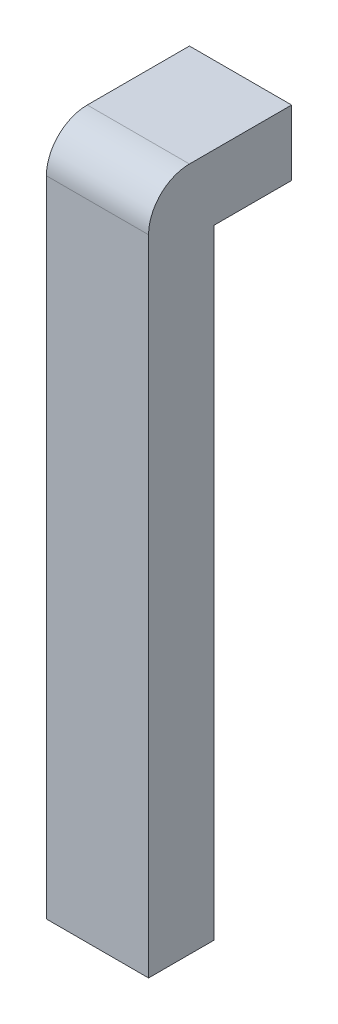
ISO-10303-21;
HEADER;
FILE_DESCRIPTION(('STEP AP214'),'2;1');
FILE_NAME('part.step','',(''),(''),'','','');
FILE_SCHEMA(('AUTOMOTIVE_DESIGN { 1 0 10303 214 1 1 1 1 }'));
ENDSEC;
DATA;
#1=APPLICATION_CONTEXT('core data for automotive mechanical design processes');
#2=APPLICATION_PROTOCOL_DEFINITION('international standard','automotive_design',2000,#1);
#3=PRODUCT_CONTEXT('',#1,'mechanical');
#4=PRODUCT('Part','Part','',(#3));
#5=PRODUCT_RELATED_PRODUCT_CATEGORY('part','',(#4));
#6=PRODUCT_DEFINITION_FORMATION('','',#4);
#7=PRODUCT_DEFINITION_CONTEXT('part definition',#1,'design');
#8=PRODUCT_DEFINITION('design','',#6,#7);
#9=PRODUCT_DEFINITION_SHAPE('','',#8);
#10=(LENGTH_UNIT() NAMED_UNIT(*) SI_UNIT(.MILLI.,.METRE.));
#11=(NAMED_UNIT(*) PLANE_ANGLE_UNIT() SI_UNIT($,.RADIAN.));
#12=(NAMED_UNIT(*) SI_UNIT($,.STERADIAN.) SOLID_ANGLE_UNIT());
#13=UNCERTAINTY_MEASURE_WITH_UNIT(LENGTH_MEASURE(1.E-05),#10,'distance_accuracy_value','');
#14=(GEOMETRIC_REPRESENTATION_CONTEXT(3) GLOBAL_UNCERTAINTY_ASSIGNED_CONTEXT((#13)) GLOBAL_UNIT_ASSIGNED_CONTEXT((#10,
#11,#12)) REPRESENTATION_CONTEXT('',''));
#15=CARTESIAN_POINT('',(0.,0.,0.));
#16=DIRECTION('',(0.,0.,1.));
#17=DIRECTION('',(1.,0.,0.));
#18=AXIS2_PLACEMENT_3D('',#15,#16,#17);
#19=CARTESIAN_POINT('',(0.,35.,50.));
#20=DIRECTION('',(-1.,0.,0.));
#21=DIRECTION('',(0.,0.,1.));
#22=AXIS2_PLACEMENT_3D('',#19,#20,#21);
#23=CYLINDRICAL_SURFACE('',#22,20.);
#24=DIRECTION('',(-1.,0.,0.));
#25=VECTOR('',#24,1.);
#26=CARTESIAN_POINT('',(0.,35.,70.));
#27=LINE('',#26,#25);
#28=CARTESIAN_POINT('',(50.,35.,70.));
#29=VERTEX_POINT('',#28);
#30=CARTESIAN_POINT('',(0.,35.,70.));
#31=VERTEX_POINT('',#30);
#32=EDGE_CURVE('E277',#29,#31,#27,.T.);
#33=ORIENTED_EDGE('',*,*,#32,.F.);
#34=CARTESIAN_POINT('',(50.,35.,50.));
#35=DIRECTION('',(-1.,0.,0.));
#36=DIRECTION('',(0.,0.,1.));
#37=AXIS2_PLACEMENT_3D('',#34,#35,#36);
#38=CIRCLE('',#37,20.);
#39=CARTESIAN_POINT('',(50.,55.,50.));
#40=VERTEX_POINT('',#39);
#41=EDGE_CURVE('E48',#40,#29,#38,.F.);
#42=ORIENTED_EDGE('',*,*,#41,.F.);
#43=DIRECTION('',(-1.,0.,0.));
#44=VECTOR('',#43,1.);
#45=CARTESIAN_POINT('',(0.,55.,50.));
#46=LINE('',#45,#44);
#47=CARTESIAN_POINT('',(0.,55.,50.));
#48=VERTEX_POINT('',#47);
#49=EDGE_CURVE('E281',#48,#40,#46,.F.);
#50=ORIENTED_EDGE('',*,*,#49,.F.);
#51=CARTESIAN_POINT('',(0.,35.,50.));
#52=DIRECTION('',(1.,0.,0.));
#53=DIRECTION('',(0.,0.,-1.));
#54=AXIS2_PLACEMENT_3D('',#51,#52,#53);
#55=CIRCLE('',#54,20.);
#56=EDGE_CURVE('E11',#31,#48,#55,.F.);
#57=ORIENTED_EDGE('',*,*,#56,.F.);
#58=EDGE_LOOP('',(#33,#42,#50,#57));
#59=FACE_BOUND('',#58,.T.);
#60=ADVANCED_FACE('F39',(#59),#23,.T.);
#61=CARTESIAN_POINT('',(0.,0.,38.));
#62=DIRECTION('',(0.,0.,-1.));
#63=DIRECTION('',(-1.,0.,0.));
#64=AXIS2_PLACEMENT_3D('',#61,#62,#63);
#65=PLANE('',#64);
#66=DIRECTION('',(0.,-1.,0.));
#67=VECTOR('',#66,1.);
#68=CARTESIAN_POINT('',(37.7,47.,38.));
#69=LINE('',#68,#67);
#70=CARTESIAN_POINT('',(37.7,28.,38.));
#71=VERTEX_POINT('',#70);
#72=CARTESIAN_POINT('',(37.7,23.,38.));
#73=VERTEX_POINT('',#72);
#74=EDGE_CURVE('E244',#71,#73,#69,.T.);
#75=ORIENTED_EDGE('',*,*,#74,.T.);
#76=DIRECTION('',(-1.,0.,0.));
#77=VECTOR('',#76,1.);
#78=CARTESIAN_POINT('',(50.,23.,38.));
#79=LINE('',#78,#77);
#80=CARTESIAN_POINT('',(50.,23.,38.));
#81=VERTEX_POINT('',#80);
#82=EDGE_CURVE('E190',#81,#73,#79,.T.);
#83=ORIENTED_EDGE('',*,*,#82,.F.);
#84=DIRECTION('',(0.,-1.,0.));
#85=VECTOR('',#84,1.);
#86=CARTESIAN_POINT('',(50.,25.,38.));
#87=LINE('',#86,#85);
#88=CARTESIAN_POINT('',(50.,-280.,38.));
#89=VERTEX_POINT('',#88);
#90=EDGE_CURVE('E144',#81,#89,#87,.T.);
#91=ORIENTED_EDGE('',*,*,#90,.T.);
#92=DIRECTION('',(1.,0.,0.));
#93=VECTOR('',#92,1.);
#94=CARTESIAN_POINT('',(0.,-280.,38.));
#95=LINE('',#94,#93);
#96=CARTESIAN_POINT('',(0.,-280.,38.));
#97=VERTEX_POINT('',#96);
#98=EDGE_CURVE('E147',#97,#89,#95,.T.);
#99=ORIENTED_EDGE('',*,*,#98,.F.);
#100=DIRECTION('',(0.,1.,0.));
#101=VECTOR('',#100,1.);
#102=CARTESIAN_POINT('',(0.,25.,38.));
#103=LINE('',#102,#101);
#104=CARTESIAN_POINT('',(0.,23.,38.));
#105=VERTEX_POINT('',#104);
#106=EDGE_CURVE('E133',#97,#105,#103,.T.);
#107=ORIENTED_EDGE('',*,*,#106,.T.);
#108=DIRECTION('',(-1.,0.,0.));
#109=VECTOR('',#108,1.);
#110=CARTESIAN_POINT('',(12.2,23.,38.));
#111=LINE('',#110,#109);
#112=CARTESIAN_POINT('',(12.2,23.,38.));
#113=VERTEX_POINT('',#112);
#114=EDGE_CURVE('E178',#113,#105,#111,.T.);
#115=ORIENTED_EDGE('',*,*,#114,.F.);
#116=DIRECTION('',(0.,-1.,0.));
#117=VECTOR('',#116,1.);
#118=CARTESIAN_POINT('',(12.2,47.,38.));
#119=LINE('',#118,#117);
#120=CARTESIAN_POINT('',(12.2,28.,38.));
#121=VERTEX_POINT('',#120);
#122=EDGE_CURVE('E241',#121,#113,#119,.T.);
#123=ORIENTED_EDGE('',*,*,#122,.F.);
#124=DIRECTION('',(-1.,0.,0.));
#125=VECTOR('',#124,1.);
#126=CARTESIAN_POINT('',(12.2,28.,38.));
#127=LINE('',#126,#125);
#128=EDGE_CURVE('E215',#71,#121,#127,.T.);
#129=ORIENTED_EDGE('',*,*,#128,.F.);
#130=EDGE_LOOP('',(#75,#83,#91,#99,#107,#115,#123,#129));
#131=FACE_BOUND('',#130,.T.);
#132=ADVANCED_FACE('F148',(#131),#65,.T.);
#133=CARTESIAN_POINT('',(12.2,47.,2.));
#134=DIRECTION('',(-1.,0.,0.));
#135=DIRECTION('',(0.,0.,1.));
#136=AXIS2_PLACEMENT_3D('',#133,#134,#135);
#137=PLANE('',#136);
#138=DIRECTION('',(0.,1.,0.));
#139=VECTOR('',#138,1.);
#140=CARTESIAN_POINT('',(12.2,28.,37.));
#141=LINE('',#140,#139);
#142=CARTESIAN_POINT('',(12.2,28.,37.));
#143=VERTEX_POINT('',#142);
#144=CARTESIAN_POINT('',(12.2,47.,37.));
#145=VERTEX_POINT('',#144);
#146=EDGE_CURVE('E226',#143,#145,#141,.T.);
#147=ORIENTED_EDGE('',*,*,#146,.F.);
#148=DIRECTION('',(0.,0.,-1.));
#149=VECTOR('',#148,1.);
#150=CARTESIAN_POINT('',(12.2,28.,38.));
#151=LINE('',#150,#149);
#152=EDGE_CURVE('E203',#121,#143,#151,.T.);
#153=ORIENTED_EDGE('',*,*,#152,.F.);
#154=ORIENTED_EDGE('',*,*,#122,.T.);
#155=DIRECTION('',(0.,0.,1.));
#156=VECTOR('',#155,1.);
#157=CARTESIAN_POINT('',(12.2,23.,2.));
#158=LINE('',#157,#156);
#159=CARTESIAN_POINT('',(12.2,23.,2.));
#160=VERTEX_POINT('',#159);
#161=EDGE_CURVE('E174',#160,#113,#158,.T.);
#162=ORIENTED_EDGE('',*,*,#161,.F.);
#163=DIRECTION('',(0.,-1.,0.));
#164=VECTOR('',#163,1.);
#165=CARTESIAN_POINT('',(12.2,47.,2.));
#166=LINE('',#165,#164);
#167=CARTESIAN_POINT('',(12.2,47.,2.));
#168=VERTEX_POINT('',#167);
#169=EDGE_CURVE('E240',#168,#160,#166,.T.);
#170=ORIENTED_EDGE('',*,*,#169,.F.);
#171=DIRECTION('',(0.,0.,-1.));
#172=VECTOR('',#171,1.);
#173=CARTESIAN_POINT('',(12.2,47.,2.));
#174=LINE('',#173,#172);
#175=EDGE_CURVE('E230',#145,#168,#174,.T.);
#176=ORIENTED_EDGE('',*,*,#175,.F.);
#177=EDGE_LOOP('',(#147,#153,#154,#162,#170,#176));
#178=FACE_BOUND('',#177,.T.);
#179=ADVANCED_FACE('F333',(#178),#137,.F.);
#180=CARTESIAN_POINT('',(37.7,47.,38.));
#181=DIRECTION('',(1.,0.,0.));
#182=DIRECTION('',(0.,0.,-1.));
#183=AXIS2_PLACEMENT_3D('',#180,#181,#182);
#184=PLANE('',#183);
#185=DIRECTION('',(0.,1.,0.));
#186=VECTOR('',#185,1.);
#187=CARTESIAN_POINT('',(37.7,28.,37.));
#188=LINE('',#187,#186);
#189=CARTESIAN_POINT('',(37.7,28.,37.));
#190=VERTEX_POINT('',#189);
#191=CARTESIAN_POINT('',(37.7,47.,37.));
#192=VERTEX_POINT('',#191);
#193=EDGE_CURVE('E219',#190,#192,#188,.T.);
#194=ORIENTED_EDGE('',*,*,#193,.T.);
#195=DIRECTION('',(0.,0.,1.));
#196=VECTOR('',#195,1.);
#197=CARTESIAN_POINT('',(37.7,47.,38.));
#198=LINE('',#197,#196);
#199=CARTESIAN_POINT('',(37.7,47.,2.));
#200=VERTEX_POINT('',#199);
#201=EDGE_CURVE('E237',#200,#192,#198,.T.);
#202=ORIENTED_EDGE('',*,*,#201,.F.);
#203=DIRECTION('',(0.,-1.,0.));
#204=VECTOR('',#203,1.);
#205=CARTESIAN_POINT('',(37.7,47.,2.));
#206=LINE('',#205,#204);
#207=CARTESIAN_POINT('',(37.7,23.,2.));
#208=VERTEX_POINT('',#207);
#209=EDGE_CURVE('E247',#200,#208,#206,.T.);
#210=ORIENTED_EDGE('',*,*,#209,.T.);
#211=DIRECTION('',(0.,0.,-1.));
#212=VECTOR('',#211,1.);
#213=CARTESIAN_POINT('',(37.7,23.,38.));
#214=LINE('',#213,#212);
#215=EDGE_CURVE('E194',#73,#208,#214,.T.);
#216=ORIENTED_EDGE('',*,*,#215,.F.);
#217=ORIENTED_EDGE('',*,*,#74,.F.);
#218=DIRECTION('',(0.,0.,1.));
#219=VECTOR('',#218,1.);
#220=CARTESIAN_POINT('',(37.7,28.,38.));
#221=LINE('',#220,#219);
#222=EDGE_CURVE('E211',#190,#71,#221,.T.);
#223=ORIENTED_EDGE('',*,*,#222,.F.);
#224=EDGE_LOOP('',(#194,#202,#210,#216,#217,#223));
#225=FACE_BOUND('',#224,.T.);
#226=ADVANCED_FACE('F338',(#225),#184,.F.);
#227=CARTESIAN_POINT('',(0.,47.,0.));
#228=DIRECTION('',(0.,1.,0.));
#229=DIRECTION('',(0.,0.,1.));
#230=AXIS2_PLACEMENT_3D('',#227,#228,#229);
#231=PLANE('',#230);
#232=DIRECTION('',(1.,0.,0.));
#233=VECTOR('',#232,1.);
#234=CARTESIAN_POINT('',(12.2,47.,37.));
#235=LINE('',#234,#233);
#236=EDGE_CURVE('E202',#145,#192,#235,.T.);
#237=ORIENTED_EDGE('',*,*,#236,.F.);
#238=ORIENTED_EDGE('',*,*,#175,.T.);
#239=DIRECTION('',(1.,0.,0.));
#240=VECTOR('',#239,1.);
#241=CARTESIAN_POINT('',(37.7,47.,2.));
#242=LINE('',#241,#240);
#243=EDGE_CURVE('E233',#168,#200,#242,.T.);
#244=ORIENTED_EDGE('',*,*,#243,.T.);
#245=ORIENTED_EDGE('',*,*,#201,.T.);
#246=EDGE_LOOP('',(#237,#238,#244,#245));
#247=FACE_BOUND('',#246,.T.);
#248=ADVANCED_FACE('F348',(#247),#231,.F.);
#249=CARTESIAN_POINT('',(0.,0.,70.));
#250=DIRECTION('',(1.,0.,0.));
#251=DIRECTION('',(0.,0.,-1.));
#252=AXIS2_PLACEMENT_3D('',#249,#250,#251);
#253=PLANE('',#252);
#254=DIRECTION('',(0.,-1.,0.));
#255=VECTOR('',#254,1.);
#256=CARTESIAN_POINT('',(0.,0.,70.));
#257=LINE('',#256,#255);
#258=CARTESIAN_POINT('',(0.,-280.,70.));
#259=VERTEX_POINT('',#258);
#260=EDGE_CURVE('E254',#31,#259,#257,.T.);
#261=ORIENTED_EDGE('',*,*,#260,.F.);
#262=ORIENTED_EDGE('',*,*,#56,.T.);
#263=DIRECTION('',(0.,0.,-1.));
#264=VECTOR('',#263,1.);
#265=CARTESIAN_POINT('',(0.,55.,70.));
#266=LINE('',#265,#264);
#267=CARTESIAN_POINT('',(0.,55.,0.));
#268=VERTEX_POINT('',#267);
#269=EDGE_CURVE('E262',#48,#268,#266,.T.);
#270=ORIENTED_EDGE('',*,*,#269,.T.);
#271=DIRECTION('',(0.,-1.,0.));
#272=VECTOR('',#271,1.);
#273=CARTESIAN_POINT('',(0.,0.,0.));
#274=LINE('',#273,#272);
#275=CARTESIAN_POINT('',(0.,23.,0.));
#276=VERTEX_POINT('',#275);
#277=EDGE_CURVE('E143',#268,#276,#274,.T.);
#278=ORIENTED_EDGE('',*,*,#277,.T.);
#279=DIRECTION('',(0.,0.,-1.));
#280=VECTOR('',#279,1.);
#281=CARTESIAN_POINT('',(0.,23.,38.));
#282=LINE('',#281,#280);
#283=EDGE_CURVE('E139',#105,#276,#282,.T.);
#284=ORIENTED_EDGE('',*,*,#283,.F.);
#285=ORIENTED_EDGE('',*,*,#106,.F.);
#286=DIRECTION('',(0.,0.,-1.));
#287=VECTOR('',#286,1.);
#288=CARTESIAN_POINT('',(0.,-280.,70.));
#289=LINE('',#288,#287);
#290=EDGE_CURVE('E137',#259,#97,#289,.T.);
#291=ORIENTED_EDGE('',*,*,#290,.F.);
#292=EDGE_LOOP('',(#261,#262,#270,#278,#284,#285,#291));
#293=FACE_BOUND('',#292,.T.);
#294=ADVANCED_FACE('F135',(#293),#253,.F.);
#295=CARTESIAN_POINT('',(50.,0.,70.));
#296=DIRECTION('',(-1.,0.,0.));
#297=DIRECTION('',(0.,0.,1.));
#298=AXIS2_PLACEMENT_3D('',#295,#296,#297);
#299=PLANE('',#298);
#300=DIRECTION('',(0.,0.,-1.));
#301=VECTOR('',#300,1.);
#302=CARTESIAN_POINT('',(50.,55.,70.));
#303=LINE('',#302,#301);
#304=CARTESIAN_POINT('',(50.,55.,0.));
#305=VERTEX_POINT('',#304);
#306=EDGE_CURVE('E274',#40,#305,#303,.T.);
#307=ORIENTED_EDGE('',*,*,#306,.F.);
#308=ORIENTED_EDGE('',*,*,#41,.T.);
#309=DIRECTION('',(0.,1.,0.));
#310=VECTOR('',#309,1.);
#311=CARTESIAN_POINT('',(50.,0.,70.));
#312=LINE('',#311,#310);
#313=CARTESIAN_POINT('',(50.,-280.,70.));
#314=VERTEX_POINT('',#313);
#315=EDGE_CURVE('E257',#314,#29,#312,.T.);
#316=ORIENTED_EDGE('',*,*,#315,.F.);
#317=DIRECTION('',(0.,0.,1.));
#318=VECTOR('',#317,1.);
#319=CARTESIAN_POINT('',(50.,-280.,70.));
#320=LINE('',#319,#318);
#321=EDGE_CURVE('E155',#89,#314,#320,.T.);
#322=ORIENTED_EDGE('',*,*,#321,.F.);
#323=ORIENTED_EDGE('',*,*,#90,.F.);
#324=DIRECTION('',(0.,0.,1.));
#325=VECTOR('',#324,1.);
#326=CARTESIAN_POINT('',(50.,23.,0.));
#327=LINE('',#326,#325);
#328=CARTESIAN_POINT('',(50.,23.,0.));
#329=VERTEX_POINT('',#328);
#330=EDGE_CURVE('E187',#329,#81,#327,.T.);
#331=ORIENTED_EDGE('',*,*,#330,.F.);
#332=DIRECTION('',(0.,1.,0.));
#333=VECTOR('',#332,1.);
#334=CARTESIAN_POINT('',(50.,0.,0.));
#335=LINE('',#334,#333);
#336=EDGE_CURVE('E265',#329,#305,#335,.T.);
#337=ORIENTED_EDGE('',*,*,#336,.T.);
#338=EDGE_LOOP('',(#307,#308,#316,#322,#323,#331,#337));
#339=FACE_BOUND('',#338,.T.);
#340=ADVANCED_FACE('F316',(#339),#299,.F.);
#341=CARTESIAN_POINT('',(0.,55.,70.));
#342=DIRECTION('',(0.,-1.,0.));
#343=DIRECTION('',(0.,0.,-1.));
#344=AXIS2_PLACEMENT_3D('',#341,#342,#343);
#345=PLANE('',#344);
#346=ORIENTED_EDGE('',*,*,#269,.F.);
#347=ORIENTED_EDGE('',*,*,#49,.T.);
#348=ORIENTED_EDGE('',*,*,#306,.T.);
#349=DIRECTION('',(-1.,0.,0.));
#350=VECTOR('',#349,1.);
#351=CARTESIAN_POINT('',(0.,55.,0.));
#352=LINE('',#351,#350);
#353=EDGE_CURVE('E258',#305,#268,#352,.T.);
#354=ORIENTED_EDGE('',*,*,#353,.T.);
#355=EDGE_LOOP('',(#346,#347,#348,#354));
#356=FACE_BOUND('',#355,.T.);
#357=ADVANCED_FACE('F320',(#356),#345,.F.);
#358=CARTESIAN_POINT('',(0.,0.,70.));
#359=DIRECTION('',(0.,0.,-1.));
#360=DIRECTION('',(-1.,0.,0.));
#361=AXIS2_PLACEMENT_3D('',#358,#359,#360);
#362=PLANE('',#361);
#363=ORIENTED_EDGE('',*,*,#315,.T.);
#364=ORIENTED_EDGE('',*,*,#32,.T.);
#365=ORIENTED_EDGE('',*,*,#260,.T.);
#366=DIRECTION('',(-1.,0.,0.));
#367=VECTOR('',#366,1.);
#368=CARTESIAN_POINT('',(0.,-280.,70.));
#369=LINE('',#368,#367);
#370=EDGE_CURVE('E160',#314,#259,#369,.T.);
#371=ORIENTED_EDGE('',*,*,#370,.F.);
#372=EDGE_LOOP('',(#363,#364,#365,#371));
#373=FACE_BOUND('',#372,.T.);
#374=ADVANCED_FACE('F305',(#373),#362,.F.);
#375=CARTESIAN_POINT('',(0.,0.,0.));
#376=DIRECTION('',(0.,0.,-1.));
#377=DIRECTION('',(-1.,0.,0.));
#378=AXIS2_PLACEMENT_3D('',#375,#376,#377);
#379=PLANE('',#378);
#380=CARTESIAN_POINT('',(15.2,44.1402000428837,0.));
#381=DIRECTION('',(0.,0.,-1.));
#382=DIRECTION('',(-1.,0.,0.));
#383=AXIS2_PLACEMENT_3D('',#380,#381,#382);
#384=CIRCLE('',#383,1.);
#385=CARTESIAN_POINT('',(14.2,44.1402000428837,0.));
#386=VERTEX_POINT('',#385);
#387=EDGE_CURVE('E287',#386,#386,#384,.T.);
#388=ORIENTED_EDGE('',*,*,#387,.F.);
#389=EDGE_LOOP('',(#388));
#390=FACE_BOUND('',#389,.T.);
#391=CARTESIAN_POINT('',(34.8,44.1402000428837,0.));
#392=DIRECTION('',(0.,0.,-1.));
#393=DIRECTION('',(-1.,0.,0.));
#394=AXIS2_PLACEMENT_3D('',#391,#392,#393);
#395=CIRCLE('',#394,0.999999999999998);
#396=CARTESIAN_POINT('',(33.8,44.1402000428837,0.));
#397=VERTEX_POINT('',#396);
#398=EDGE_CURVE('E167',#397,#397,#395,.T.);
#399=ORIENTED_EDGE('',*,*,#398,.F.);
#400=EDGE_LOOP('',(#399));
#401=FACE_BOUND('',#400,.T.);
#402=ORIENTED_EDGE('',*,*,#336,.F.);
#403=DIRECTION('',(1.,0.,0.));
#404=VECTOR('',#403,1.);
#405=CARTESIAN_POINT('',(0.,23.,0.));
#406=LINE('',#405,#404);
#407=EDGE_CURVE('E183',#276,#329,#406,.T.);
#408=ORIENTED_EDGE('',*,*,#407,.F.);
#409=ORIENTED_EDGE('',*,*,#277,.F.);
#410=ORIENTED_EDGE('',*,*,#353,.F.);
#411=EDGE_LOOP('',(#402,#408,#409,#410));
#412=FACE_BOUND('',#411,.T.);
#413=ADVANCED_FACE('F301',(#390,#401,#412),#379,.T.);
#414=CARTESIAN_POINT('',(37.7,47.,2.));
#415=DIRECTION('',(0.,0.,-1.));
#416=DIRECTION('',(-1.,0.,0.));
#417=AXIS2_PLACEMENT_3D('',#414,#415,#416);
#418=PLANE('',#417);
#419=CARTESIAN_POINT('',(15.2,44.1402000428837,2.));
#420=DIRECTION('',(0.,0.,-1.));
#421=DIRECTION('',(-1.,0.,0.));
#422=AXIS2_PLACEMENT_3D('',#419,#420,#421);
#423=CIRCLE('',#422,1.);
#424=CARTESIAN_POINT('',(14.2,44.1402000428837,2.));
#425=VERTEX_POINT('',#424);
#426=EDGE_CURVE('E42',#425,#425,#423,.T.);
#427=ORIENTED_EDGE('',*,*,#426,.T.);
#428=EDGE_LOOP('',(#427));
#429=FACE_BOUND('',#428,.T.);
#430=CARTESIAN_POINT('',(34.8,44.1402000428837,2.));
#431=DIRECTION('',(0.,0.,-1.));
#432=DIRECTION('',(-1.,0.,0.));
#433=AXIS2_PLACEMENT_3D('',#430,#431,#432);
#434=CIRCLE('',#433,0.999999999999998);
#435=CARTESIAN_POINT('',(33.8,44.1402000428837,2.));
#436=VERTEX_POINT('',#435);
#437=EDGE_CURVE('E165',#436,#436,#434,.T.);
#438=ORIENTED_EDGE('',*,*,#437,.T.);
#439=EDGE_LOOP('',(#438));
#440=FACE_BOUND('',#439,.T.);
#441=ORIENTED_EDGE('',*,*,#169,.T.);
#442=DIRECTION('',(-1.,0.,0.));
#443=VECTOR('',#442,1.);
#444=CARTESIAN_POINT('',(37.7,23.,2.));
#445=LINE('',#444,#443);
#446=EDGE_CURVE('E198',#208,#160,#445,.T.);
#447=ORIENTED_EDGE('',*,*,#446,.F.);
#448=ORIENTED_EDGE('',*,*,#209,.F.);
#449=ORIENTED_EDGE('',*,*,#243,.F.);
#450=EDGE_LOOP('',(#441,#447,#448,#449));
#451=FACE_BOUND('',#450,.T.);
#452=ADVANCED_FACE('F304',(#429,#440,#451),#418,.F.);
#453=CARTESIAN_POINT('',(12.2,28.,37.));
#454=DIRECTION('',(0.,0.,1.));
#455=DIRECTION('',(1.,0.,0.));
#456=AXIS2_PLACEMENT_3D('',#453,#454,#455);
#457=PLANE('',#456);
#458=ORIENTED_EDGE('',*,*,#236,.T.);
#459=ORIENTED_EDGE('',*,*,#193,.F.);
#460=DIRECTION('',(1.,0.,0.));
#461=VECTOR('',#460,1.);
#462=CARTESIAN_POINT('',(12.2,28.,37.));
#463=LINE('',#462,#461);
#464=EDGE_CURVE('E207',#143,#190,#463,.T.);
#465=ORIENTED_EDGE('',*,*,#464,.F.);
#466=ORIENTED_EDGE('',*,*,#146,.T.);
#467=EDGE_LOOP('',(#458,#459,#465,#466));
#468=FACE_BOUND('',#467,.T.);
#469=ADVANCED_FACE('F344',(#468),#457,.F.);
#470=CARTESIAN_POINT('',(0.,28.,0.));
#471=DIRECTION('',(0.,-1.,0.));
#472=DIRECTION('',(0.,0.,-1.));
#473=AXIS2_PLACEMENT_3D('',#470,#471,#472);
#474=PLANE('',#473);
#475=ORIENTED_EDGE('',*,*,#152,.T.);
#476=ORIENTED_EDGE('',*,*,#464,.T.);
#477=ORIENTED_EDGE('',*,*,#222,.T.);
#478=ORIENTED_EDGE('',*,*,#128,.T.);
#479=EDGE_LOOP('',(#475,#476,#477,#478));
#480=FACE_BOUND('',#479,.T.);
#481=ADVANCED_FACE('F355',(#480),#474,.T.);
#482=CARTESIAN_POINT('',(0.,23.,0.));
#483=DIRECTION('',(0.,-1.,0.));
#484=DIRECTION('',(0.,0.,-1.));
#485=AXIS2_PLACEMENT_3D('',#482,#483,#484);
#486=PLANE('',#485);
#487=ORIENTED_EDGE('',*,*,#161,.T.);
#488=ORIENTED_EDGE('',*,*,#114,.T.);
#489=ORIENTED_EDGE('',*,*,#283,.T.);
#490=ORIENTED_EDGE('',*,*,#407,.T.);
#491=ORIENTED_EDGE('',*,*,#330,.T.);
#492=ORIENTED_EDGE('',*,*,#82,.T.);
#493=ORIENTED_EDGE('',*,*,#215,.T.);
#494=ORIENTED_EDGE('',*,*,#446,.T.);
#495=EDGE_LOOP('',(#487,#488,#489,#490,#491,#492,#493,#494));
#496=FACE_BOUND('',#495,.T.);
#497=ADVANCED_FACE('F315',(#496),#486,.T.);
#498=CARTESIAN_POINT('',(0.,-280.,0.));
#499=DIRECTION('',(0.,-1.,0.));
#500=DIRECTION('',(0.,0.,-1.));
#501=AXIS2_PLACEMENT_3D('',#498,#499,#500);
#502=PLANE('',#501);
#503=ORIENTED_EDGE('',*,*,#290,.T.);
#504=ORIENTED_EDGE('',*,*,#98,.T.);
#505=ORIENTED_EDGE('',*,*,#321,.T.);
#506=ORIENTED_EDGE('',*,*,#370,.T.);
#507=EDGE_LOOP('',(#503,#504,#505,#506));
#508=FACE_BOUND('',#507,.T.);
#509=ADVANCED_FACE('F158',(#508),#502,.T.);
#510=CARTESIAN_POINT('',(34.8,44.1402000428837,10.));
#511=DIRECTION('',(0.,0.,-1.));
#512=DIRECTION('',(-1.,0.,0.));
#513=AXIS2_PLACEMENT_3D('',#510,#511,#512);
#514=CYLINDRICAL_SURFACE('',#513,0.999999999999998);
#515=ORIENTED_EDGE('',*,*,#398,.T.);
#516=EDGE_LOOP('',(#515));
#517=FACE_BOUND('',#516,.T.);
#518=ORIENTED_EDGE('',*,*,#437,.F.);
#519=EDGE_LOOP('',(#518));
#520=FACE_BOUND('',#519,.T.);
#521=ADVANCED_FACE('F298',(#517,#520),#514,.F.);
#522=CARTESIAN_POINT('',(15.2,44.1402000428837,10.));
#523=DIRECTION('',(0.,0.,-1.));
#524=DIRECTION('',(-1.,0.,0.));
#525=AXIS2_PLACEMENT_3D('',#522,#523,#524);
#526=CYLINDRICAL_SURFACE('',#525,1.);
#527=ORIENTED_EDGE('',*,*,#387,.T.);
#528=EDGE_LOOP('',(#527));
#529=FACE_BOUND('',#528,.T.);
#530=ORIENTED_EDGE('',*,*,#426,.F.);
#531=EDGE_LOOP('',(#530));
#532=FACE_BOUND('',#531,.T.);
#533=ADVANCED_FACE('F366',(#529,#532),#526,.F.);
#534=CLOSED_SHELL('',(#60,#132,#179,#226,#248,#294,#340,#357,#374,#413,#452,#469,#481,#497,#509,
#521,#533));
#535=MANIFOLD_SOLID_BREP('B2',#534);
#536=ADVANCED_BREP_SHAPE_REPRESENTATION('',(#18,#535),#14);
#537=SHAPE_DEFINITION_REPRESENTATION(#9,#536);
ENDSEC;
END-ISO-10303-21;
